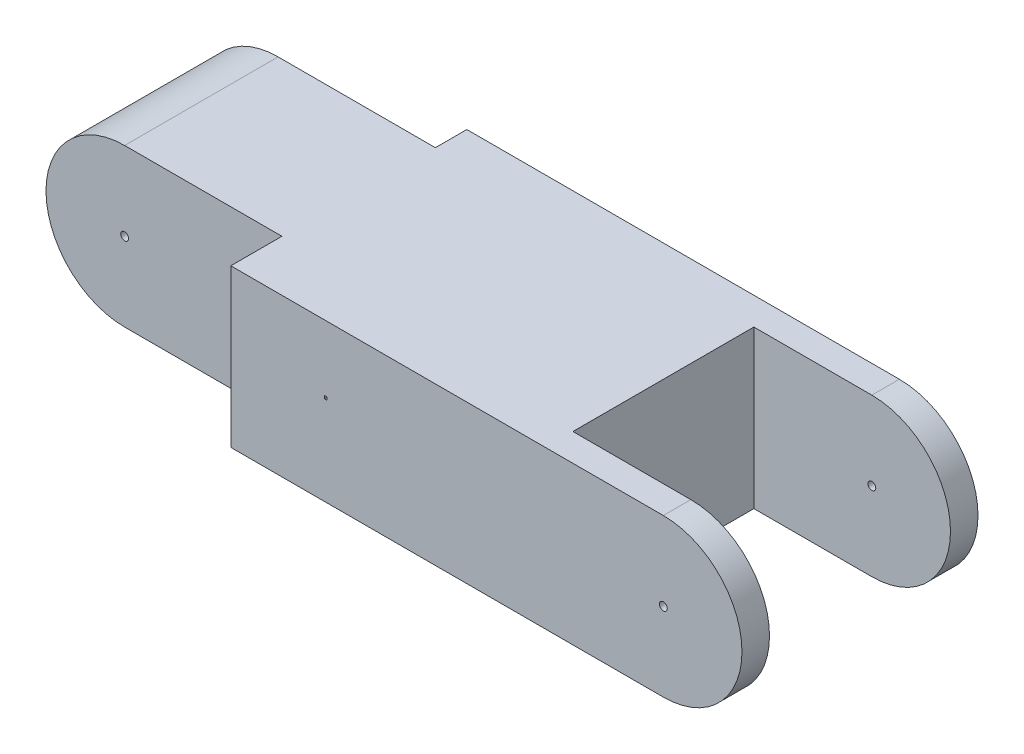
ISO-10303-21;
HEADER;
FILE_DESCRIPTION(('STEP AP214'),'2;1');
FILE_NAME('part.step','',(''),(''),'','','');
FILE_SCHEMA(('AUTOMOTIVE_DESIGN { 1 0 10303 214 1 1 1 1 }'));
ENDSEC;
DATA;
#1=APPLICATION_CONTEXT('core data for automotive mechanical design processes');
#2=APPLICATION_PROTOCOL_DEFINITION('international standard','automotive_design',2000,#1);
#3=PRODUCT_CONTEXT('',#1,'mechanical');
#4=PRODUCT('Part','Part','',(#3));
#5=PRODUCT_RELATED_PRODUCT_CATEGORY('part','',(#4));
#6=PRODUCT_DEFINITION_FORMATION('','',#4);
#7=PRODUCT_DEFINITION_CONTEXT('part definition',#1,'design');
#8=PRODUCT_DEFINITION('design','',#6,#7);
#9=PRODUCT_DEFINITION_SHAPE('','',#8);
#10=(LENGTH_UNIT() NAMED_UNIT(*) SI_UNIT(.MILLI.,.METRE.));
#11=(NAMED_UNIT(*) PLANE_ANGLE_UNIT() SI_UNIT($,.RADIAN.));
#12=(NAMED_UNIT(*) SI_UNIT($,.STERADIAN.) SOLID_ANGLE_UNIT());
#13=UNCERTAINTY_MEASURE_WITH_UNIT(LENGTH_MEASURE(1.E-05),#10,'distance_accuracy_value','');
#14=(GEOMETRIC_REPRESENTATION_CONTEXT(3) GLOBAL_UNCERTAINTY_ASSIGNED_CONTEXT((#13)) GLOBAL_UNIT_ASSIGNED_CONTEXT((#10,
#11,#12)) REPRESENTATION_CONTEXT('',''));
#15=CARTESIAN_POINT('',(0.,0.,0.));
#16=DIRECTION('',(0.,0.,1.));
#17=DIRECTION('',(1.,0.,0.));
#18=AXIS2_PLACEMENT_3D('',#15,#16,#17);
#19=CARTESIAN_POINT('',(0.,20.,-20.0272569339945));
#20=DIRECTION('',(0.,0.,1.));
#21=DIRECTION('',(1.,0.,0.));
#22=AXIS2_PLACEMENT_3D('',#19,#20,#21);
#23=CYLINDRICAL_SURFACE('',#22,20.);
#24=CARTESIAN_POINT('',(0.,20.,33.));
#25=DIRECTION('',(0.,0.,-1.));
#26=DIRECTION('',(-1.,0.,0.));
#27=AXIS2_PLACEMENT_3D('',#24,#25,#26);
#28=CIRCLE('',#27,20.);
#29=CARTESIAN_POINT('',(0.,0.,33.));
#30=VERTEX_POINT('',#29);
#31=CARTESIAN_POINT('',(0.,40.,33.));
#32=VERTEX_POINT('',#31);
#33=EDGE_CURVE('E50',#30,#32,#28,.F.);
#34=ORIENTED_EDGE('',*,*,#33,.T.);
#35=DIRECTION('',(0.,0.,1.));
#36=VECTOR('',#35,1.);
#37=CARTESIAN_POINT('',(0.,40.,-20.0272569339945));
#38=LINE('',#37,#36);
#39=CARTESIAN_POINT('',(0.,40.,40.));
#40=VERTEX_POINT('',#39);
#41=EDGE_CURVE('E325',#32,#40,#38,.T.);
#42=ORIENTED_EDGE('',*,*,#41,.T.);
#43=CARTESIAN_POINT('',(0.,20.,40.));
#44=DIRECTION('',(0.,0.,1.));
#45=DIRECTION('',(-1.,0.,0.));
#46=AXIS2_PLACEMENT_3D('',#43,#44,#45);
#47=CIRCLE('',#46,20.);
#48=CARTESIAN_POINT('',(0.,0.,40.));
#49=VERTEX_POINT('',#48);
#50=EDGE_CURVE('E308',#49,#40,#47,.T.);
#51=ORIENTED_EDGE('',*,*,#50,.F.);
#52=DIRECTION('',(0.,0.,1.));
#53=VECTOR('',#52,1.);
#54=CARTESIAN_POINT('',(0.,0.,-20.0272569339945));
#55=LINE('',#54,#53);
#56=EDGE_CURVE('E330',#30,#49,#55,.T.);
#57=ORIENTED_EDGE('',*,*,#56,.F.);
#58=EDGE_LOOP('',(#34,#42,#51,#57));
#59=FACE_BOUND('',#58,.T.);
#60=ADVANCED_FACE('F41',(#59),#23,.T.);
#61=CARTESIAN_POINT('',(0.,0.,-20.0272569339945));
#62=DIRECTION('',(0.,-1.,0.));
#63=DIRECTION('',(1.,0.,0.));
#64=AXIS2_PLACEMENT_3D('',#61,#62,#63);
#65=PLANE('',#64);
#66=DIRECTION('',(1.,0.,0.));
#67=VECTOR('',#66,1.);
#68=CARTESIAN_POINT('',(0.,0.,-13.0272569339945));
#69=LINE('',#68,#67);
#70=CARTESIAN_POINT('',(-30.,0.,-13.0272569339945));
#71=VERTEX_POINT('',#70);
#72=CARTESIAN_POINT('',(0.,0.,-13.0272569339945));
#73=VERTEX_POINT('',#72);
#74=EDGE_CURVE('E212',#71,#73,#69,.T.);
#75=ORIENTED_EDGE('',*,*,#74,.F.);
#76=DIRECTION('',(0.,0.,-1.));
#77=VECTOR('',#76,1.);
#78=CARTESIAN_POINT('',(-30.,0.,-20.0272569339945));
#79=LINE('',#78,#77);
#80=CARTESIAN_POINT('',(-30.,0.,33.));
#81=VERTEX_POINT('',#80);
#82=EDGE_CURVE('E187',#81,#71,#79,.T.);
#83=ORIENTED_EDGE('',*,*,#82,.F.);
#84=DIRECTION('',(1.,0.,0.));
#85=VECTOR('',#84,1.);
#86=CARTESIAN_POINT('',(0.,0.,33.));
#87=LINE('',#86,#85);
#88=EDGE_CURVE('E208',#81,#30,#87,.T.);
#89=ORIENTED_EDGE('',*,*,#88,.T.);
#90=ORIENTED_EDGE('',*,*,#56,.T.);
#91=DIRECTION('',(1.,0.,0.));
#92=VECTOR('',#91,1.);
#93=CARTESIAN_POINT('',(0.,0.,40.));
#94=LINE('',#93,#92);
#95=CARTESIAN_POINT('',(-110.,0.,40.));
#96=VERTEX_POINT('',#95);
#97=EDGE_CURVE('E314',#96,#49,#94,.T.);
#98=ORIENTED_EDGE('',*,*,#97,.F.);
#99=DIRECTION('',(0.,0.,-1.));
#100=VECTOR('',#99,1.);
#101=CARTESIAN_POINT('',(-110.,0.,40.));
#102=LINE('',#101,#100);
#103=CARTESIAN_POINT('',(-110.,0.,27.));
#104=VERTEX_POINT('',#103);
#105=EDGE_CURVE('E278',#96,#104,#102,.T.);
#106=ORIENTED_EDGE('',*,*,#105,.T.);
#107=DIRECTION('',(1.,0.,0.));
#108=VECTOR('',#107,1.);
#109=CARTESIAN_POINT('',(-170.,0.,27.));
#110=LINE('',#109,#108);
#111=CARTESIAN_POINT('',(-150.,0.,27.));
#112=VERTEX_POINT('',#111);
#113=EDGE_CURVE('E276',#112,#104,#110,.T.);
#114=ORIENTED_EDGE('',*,*,#113,.F.);
#115=DIRECTION('',(0.,0.,1.));
#116=VECTOR('',#115,1.);
#117=CARTESIAN_POINT('',(-150.,0.,-20.0272569339945));
#118=LINE('',#117,#116);
#119=CARTESIAN_POINT('',(-150.,0.,-12.0272569339945));
#120=VERTEX_POINT('',#119);
#121=EDGE_CURVE('E331',#120,#112,#118,.T.);
#122=ORIENTED_EDGE('',*,*,#121,.F.);
#123=DIRECTION('',(1.,0.,0.));
#124=VECTOR('',#123,1.);
#125=CARTESIAN_POINT('',(-170.,0.,-12.0272569339945));
#126=LINE('',#125,#124);
#127=CARTESIAN_POINT('',(-110.,0.,-12.0272569339945));
#128=VERTEX_POINT('',#127);
#129=EDGE_CURVE('E291',#120,#128,#126,.T.);
#130=ORIENTED_EDGE('',*,*,#129,.T.);
#131=DIRECTION('',(0.,0.,1.));
#132=VECTOR('',#131,1.);
#133=CARTESIAN_POINT('',(-110.,0.,-20.0272569339945));
#134=LINE('',#133,#132);
#135=CARTESIAN_POINT('',(-110.,0.,-20.0272569339945));
#136=VERTEX_POINT('',#135);
#137=EDGE_CURVE('E294',#136,#128,#134,.T.);
#138=ORIENTED_EDGE('',*,*,#137,.F.);
#139=DIRECTION('',(1.,0.,0.));
#140=VECTOR('',#139,1.);
#141=CARTESIAN_POINT('',(0.,0.,-20.0272569339945));
#142=LINE('',#141,#140);
#143=CARTESIAN_POINT('',(0.,0.,-20.0272569339945));
#144=VERTEX_POINT('',#143);
#145=EDGE_CURVE('E323',#136,#144,#142,.T.);
#146=ORIENTED_EDGE('',*,*,#145,.T.);
#147=EDGE_CURVE('E326',#144,#73,#55,.T.);
#148=ORIENTED_EDGE('',*,*,#147,.T.);
#149=EDGE_LOOP('',(#75,#83,#89,#90,#98,#106,#114,#122,#130,#138,#146,#148));
#150=FACE_BOUND('',#149,.T.);
#151=ADVANCED_FACE('F373',(#150),#65,.T.);
#152=CARTESIAN_POINT('',(-150.,40.,-20.0272569339945));
#153=DIRECTION('',(0.,1.,0.));
#154=DIRECTION('',(0.,0.,1.));
#155=AXIS2_PLACEMENT_3D('',#152,#153,#154);
#156=PLANE('',#155);
#157=DIRECTION('',(-1.,0.,0.));
#158=VECTOR('',#157,1.);
#159=CARTESIAN_POINT('',(0.,40.,-13.0272569339945));
#160=LINE('',#159,#158);
#161=CARTESIAN_POINT('',(0.,40.,-13.0272569339945));
#162=VERTEX_POINT('',#161);
#163=CARTESIAN_POINT('',(-30.,40.,-13.0272569339945));
#164=VERTEX_POINT('',#163);
#165=EDGE_CURVE('E194',#162,#164,#160,.T.);
#166=ORIENTED_EDGE('',*,*,#165,.F.);
#167=CARTESIAN_POINT('',(0.,40.,-20.0272569339945));
#168=VERTEX_POINT('',#167);
#169=EDGE_CURVE('E337',#168,#162,#38,.T.);
#170=ORIENTED_EDGE('',*,*,#169,.F.);
#171=DIRECTION('',(-1.,0.,0.));
#172=VECTOR('',#171,1.);
#173=CARTESIAN_POINT('',(-150.,40.,-20.0272569339945));
#174=LINE('',#173,#172);
#175=CARTESIAN_POINT('',(-110.,40.,-20.0272569339945));
#176=VERTEX_POINT('',#175);
#177=EDGE_CURVE('E320',#168,#176,#174,.T.);
#178=ORIENTED_EDGE('',*,*,#177,.T.);
#179=DIRECTION('',(0.,0.,1.));
#180=VECTOR('',#179,1.);
#181=CARTESIAN_POINT('',(-110.,40.,-20.0272569339945));
#182=LINE('',#181,#180);
#183=CARTESIAN_POINT('',(-110.,40.,-12.0272569339945));
#184=VERTEX_POINT('',#183);
#185=EDGE_CURVE('E295',#176,#184,#182,.T.);
#186=ORIENTED_EDGE('',*,*,#185,.T.);
#187=DIRECTION('',(1.,0.,0.));
#188=VECTOR('',#187,1.);
#189=CARTESIAN_POINT('',(-170.,40.,-12.0272569339945));
#190=LINE('',#189,#188);
#191=CARTESIAN_POINT('',(-150.,40.,-12.0272569339945));
#192=VERTEX_POINT('',#191);
#193=EDGE_CURVE('E290',#192,#184,#190,.T.);
#194=ORIENTED_EDGE('',*,*,#193,.F.);
#195=DIRECTION('',(0.,0.,1.));
#196=VECTOR('',#195,1.);
#197=CARTESIAN_POINT('',(-150.,40.,-20.0272569339945));
#198=LINE('',#197,#196);
#199=CARTESIAN_POINT('',(-150.,40.,27.));
#200=VERTEX_POINT('',#199);
#201=EDGE_CURVE('E334',#192,#200,#198,.T.);
#202=ORIENTED_EDGE('',*,*,#201,.T.);
#203=DIRECTION('',(1.,0.,0.));
#204=VECTOR('',#203,1.);
#205=CARTESIAN_POINT('',(-170.,40.,27.));
#206=LINE('',#205,#204);
#207=CARTESIAN_POINT('',(-110.,40.,27.));
#208=VERTEX_POINT('',#207);
#209=EDGE_CURVE('E270',#200,#208,#206,.T.);
#210=ORIENTED_EDGE('',*,*,#209,.T.);
#211=DIRECTION('',(0.,0.,-1.));
#212=VECTOR('',#211,1.);
#213=CARTESIAN_POINT('',(-110.,40.,40.));
#214=LINE('',#213,#212);
#215=CARTESIAN_POINT('',(-110.,40.,40.));
#216=VERTEX_POINT('',#215);
#217=EDGE_CURVE('E279',#216,#208,#214,.T.);
#218=ORIENTED_EDGE('',*,*,#217,.F.);
#219=DIRECTION('',(-1.,0.,0.));
#220=VECTOR('',#219,1.);
#221=CARTESIAN_POINT('',(-150.,40.,40.));
#222=LINE('',#221,#220);
#223=EDGE_CURVE('E311',#40,#216,#222,.T.);
#224=ORIENTED_EDGE('',*,*,#223,.F.);
#225=ORIENTED_EDGE('',*,*,#41,.F.);
#226=DIRECTION('',(-1.,0.,0.));
#227=VECTOR('',#226,1.);
#228=CARTESIAN_POINT('',(0.,40.,33.));
#229=LINE('',#228,#227);
#230=CARTESIAN_POINT('',(-30.,40.,33.));
#231=VERTEX_POINT('',#230);
#232=EDGE_CURVE('E191',#32,#231,#229,.T.);
#233=ORIENTED_EDGE('',*,*,#232,.T.);
#234=DIRECTION('',(0.,0.,1.));
#235=VECTOR('',#234,1.);
#236=CARTESIAN_POINT('',(-30.,40.,0.));
#237=LINE('',#236,#235);
#238=EDGE_CURVE('E184',#164,#231,#237,.T.);
#239=ORIENTED_EDGE('',*,*,#238,.F.);
#240=EDGE_LOOP('',(#166,#170,#178,#186,#194,#202,#210,#218,#224,#225,#233,#239));
#241=FACE_BOUND('',#240,.T.);
#242=ADVANCED_FACE('F201',(#241),#156,.T.);
#243=CARTESIAN_POINT('',(-150.,20.,-20.0272569339945));
#244=DIRECTION('',(0.,0.,1.));
#245=DIRECTION('',(1.,0.,0.));
#246=AXIS2_PLACEMENT_3D('',#243,#244,#245);
#247=CYLINDRICAL_SURFACE('',#246,20.);
#248=ORIENTED_EDGE('',*,*,#121,.T.);
#249=CARTESIAN_POINT('',(-150.,20.,27.));
#250=DIRECTION('',(0.,0.,1.));
#251=DIRECTION('',(1.,0.,0.));
#252=AXIS2_PLACEMENT_3D('',#249,#250,#251);
#253=CIRCLE('',#252,20.);
#254=EDGE_CURVE('E329',#112,#200,#253,.F.);
#255=ORIENTED_EDGE('',*,*,#254,.T.);
#256=ORIENTED_EDGE('',*,*,#201,.F.);
#257=CARTESIAN_POINT('',(-150.,20.,-12.0272569339945));
#258=DIRECTION('',(0.,0.,1.));
#259=DIRECTION('',(1.,0.,0.));
#260=AXIS2_PLACEMENT_3D('',#257,#258,#259);
#261=CIRCLE('',#260,20.);
#262=EDGE_CURVE('E304',#120,#192,#261,.F.);
#263=ORIENTED_EDGE('',*,*,#262,.F.);
#264=EDGE_LOOP('',(#248,#255,#256,#263));
#265=FACE_BOUND('',#264,.T.);
#266=ADVANCED_FACE('F365',(#265),#247,.T.);
#267=CARTESIAN_POINT('',(0.,20.,-20.0272569339945));
#268=DIRECTION('',(0.,0.,-1.));
#269=DIRECTION('',(-1.,0.,0.));
#270=AXIS2_PLACEMENT_3D('',#267,#268,#269);
#271=PLANE('',#270);
#272=CARTESIAN_POINT('',(0.,20.,-20.0272569339945));
#273=DIRECTION('',(0.,0.,-1.));
#274=DIRECTION('',(-1.,0.,0.));
#275=AXIS2_PLACEMENT_3D('',#272,#273,#274);
#276=CIRCLE('',#275,1.);
#277=CARTESIAN_POINT('',(-1.,20.,-20.0272569339945));
#278=VERTEX_POINT('',#277);
#279=EDGE_CURVE('E199',#278,#278,#276,.T.);
#280=ORIENTED_EDGE('',*,*,#279,.F.);
#281=EDGE_LOOP('',(#280));
#282=FACE_BOUND('',#281,.T.);
#283=ORIENTED_EDGE('',*,*,#145,.F.);
#284=DIRECTION('',(0.,1.,0.));
#285=VECTOR('',#284,1.);
#286=CARTESIAN_POINT('',(-110.,0.,-20.0272569339945));
#287=LINE('',#286,#285);
#288=EDGE_CURVE('E301',#136,#176,#287,.T.);
#289=ORIENTED_EDGE('',*,*,#288,.T.);
#290=ORIENTED_EDGE('',*,*,#177,.F.);
#291=CARTESIAN_POINT('',(0.,20.,-20.0272569339945));
#292=DIRECTION('',(0.,0.,1.));
#293=DIRECTION('',(-1.,0.,0.));
#294=AXIS2_PLACEMENT_3D('',#291,#292,#293);
#295=CIRCLE('',#294,20.);
#296=EDGE_CURVE('E317',#144,#168,#295,.T.);
#297=ORIENTED_EDGE('',*,*,#296,.F.);
#298=EDGE_LOOP('',(#283,#289,#290,#297));
#299=FACE_BOUND('',#298,.T.);
#300=ADVANCED_FACE('F362',(#282,#299),#271,.T.);
#301=ORIENTED_EDGE('',*,*,#169,.T.);
#302=CARTESIAN_POINT('',(0.,20.,-13.0272569339945));
#303=DIRECTION('',(0.,0.,-1.));
#304=DIRECTION('',(-1.,0.,0.));
#305=AXIS2_PLACEMENT_3D('',#302,#303,#304);
#306=CIRCLE('',#305,20.);
#307=EDGE_CURVE('E11',#73,#162,#306,.F.);
#308=ORIENTED_EDGE('',*,*,#307,.F.);
#309=ORIENTED_EDGE('',*,*,#147,.F.);
#310=ORIENTED_EDGE('',*,*,#296,.T.);
#311=EDGE_LOOP('',(#301,#308,#309,#310));
#312=FACE_BOUND('',#311,.T.);
#313=ADVANCED_FACE('F43',(#312),#23,.T.);
#314=CARTESIAN_POINT('',(0.,20.,40.));
#315=DIRECTION('',(0.,0.,-1.));
#316=DIRECTION('',(-1.,0.,0.));
#317=AXIS2_PLACEMENT_3D('',#314,#315,#316);
#318=PLANE('',#317);
#319=CARTESIAN_POINT('',(0.,20.,40.));
#320=DIRECTION('',(0.,0.,1.));
#321=DIRECTION('',(1.,0.,0.));
#322=AXIS2_PLACEMENT_3D('',#319,#320,#321);
#323=CIRCLE('',#322,1.);
#324=CARTESIAN_POINT('',(1.,20.,40.));
#325=VERTEX_POINT('',#324);
#326=EDGE_CURVE('E344',#325,#325,#323,.T.);
#327=ORIENTED_EDGE('',*,*,#326,.F.);
#328=EDGE_LOOP('',(#327));
#329=FACE_BOUND('',#328,.T.);
#330=DIRECTION('',(1.,0.,0.));
#331=VECTOR('',#330,1.);
#332=CARTESIAN_POINT('',(-86.1875819309348,22.5876163151839,40.));
#333=LINE('',#332,#331);
#334=CARTESIAN_POINT('',(-86.1875819309348,22.5876163151839,40.));
#335=VERTEX_POINT('',#334);
#336=CARTESIAN_POINT('',(-85.5878607279806,22.5876163151839,40.));
#337=VERTEX_POINT('',#336);
#338=EDGE_CURVE('E260',#335,#337,#333,.T.);
#339=ORIENTED_EDGE('',*,*,#338,.F.);
#340=DIRECTION('',(0.,-1.,0.));
#341=VECTOR('',#340,1.);
#342=CARTESIAN_POINT('',(-86.1875819309348,23.3508978462165,40.));
#343=LINE('',#342,#341);
#344=CARTESIAN_POINT('',(-86.1875819309348,23.3508978462165,40.));
#345=VERTEX_POINT('',#344);
#346=EDGE_CURVE('E66',#345,#335,#343,.T.);
#347=ORIENTED_EDGE('',*,*,#346,.F.);
#348=DIRECTION('',(-1.,0.,0.));
#349=VECTOR('',#348,1.);
#350=CARTESIAN_POINT('',(-86.1875819309348,23.3508978462165,40.));
#351=LINE('',#350,#349);
#352=CARTESIAN_POINT('',(-85.5878607279806,23.3508978462165,40.));
#353=VERTEX_POINT('',#352);
#354=EDGE_CURVE('E249',#353,#345,#351,.T.);
#355=ORIENTED_EDGE('',*,*,#354,.F.);
#356=DIRECTION('',(0.,1.,0.));
#357=VECTOR('',#356,1.);
#358=CARTESIAN_POINT('',(-85.5878607279806,23.3508978462165,40.));
#359=LINE('',#358,#357);
#360=EDGE_CURVE('E263',#337,#353,#359,.T.);
#361=ORIENTED_EDGE('',*,*,#360,.F.);
#362=EDGE_LOOP('',(#339,#347,#355,#361));
#363=FACE_BOUND('',#362,.T.);
#364=ORIENTED_EDGE('',*,*,#223,.T.);
#365=DIRECTION('',(0.,1.,0.));
#366=VECTOR('',#365,1.);
#367=CARTESIAN_POINT('',(-110.,0.,40.));
#368=LINE('',#367,#366);
#369=EDGE_CURVE('E282',#96,#216,#368,.T.);
#370=ORIENTED_EDGE('',*,*,#369,.F.);
#371=ORIENTED_EDGE('',*,*,#97,.T.);
#372=ORIENTED_EDGE('',*,*,#50,.T.);
#373=EDGE_LOOP('',(#364,#370,#371,#372));
#374=FACE_BOUND('',#373,.T.);
#375=ADVANCED_FACE('F396',(#329,#363,#374),#318,.F.);
#376=CARTESIAN_POINT('',(-110.,0.,-20.0272569339945));
#377=DIRECTION('',(-1.,0.,0.));
#378=DIRECTION('',(0.,0.,1.));
#379=AXIS2_PLACEMENT_3D('',#376,#377,#378);
#380=PLANE('',#379);
#381=ORIENTED_EDGE('',*,*,#185,.F.);
#382=ORIENTED_EDGE('',*,*,#288,.F.);
#383=ORIENTED_EDGE('',*,*,#137,.T.);
#384=DIRECTION('',(0.,1.,0.));
#385=VECTOR('',#384,1.);
#386=CARTESIAN_POINT('',(-110.,0.,-12.0272569339945));
#387=LINE('',#386,#385);
#388=EDGE_CURVE('E297',#128,#184,#387,.T.);
#389=ORIENTED_EDGE('',*,*,#388,.T.);
#390=EDGE_LOOP('',(#381,#382,#383,#389));
#391=FACE_BOUND('',#390,.T.);
#392=ADVANCED_FACE('F378',(#391),#380,.T.);
#393=CARTESIAN_POINT('',(-170.,0.,-12.0272569339945));
#394=DIRECTION('',(0.,0.,1.));
#395=DIRECTION('',(1.,0.,0.));
#396=AXIS2_PLACEMENT_3D('',#393,#394,#395);
#397=PLANE('',#396);
#398=DIRECTION('',(-1.,0.,0.));
#399=VECTOR('',#398,1.);
#400=CARTESIAN_POINT('',(-120.,9.99999999999998,-12.0272569339945));
#401=LINE('',#400,#399);
#402=CARTESIAN_POINT('',(-120.,9.99999999999998,-12.0272569339945));
#403=VERTEX_POINT('',#402);
#404=CARTESIAN_POINT('',(-164.,9.99999999999998,-12.0272569339945));
#405=VERTEX_POINT('',#404);
#406=EDGE_CURVE('E230',#403,#405,#401,.T.);
#407=ORIENTED_EDGE('',*,*,#406,.F.);
#408=DIRECTION('',(0.,-1.,0.));
#409=VECTOR('',#408,1.);
#410=CARTESIAN_POINT('',(-120.,9.99999999999998,-12.0272569339945));
#411=LINE('',#410,#409);
#412=CARTESIAN_POINT('',(-120.,30.,-12.0272569339945));
#413=VERTEX_POINT('',#412);
#414=EDGE_CURVE('E58',#413,#403,#411,.T.);
#415=ORIENTED_EDGE('',*,*,#414,.F.);
#416=DIRECTION('',(1.,0.,0.));
#417=VECTOR('',#416,1.);
#418=CARTESIAN_POINT('',(-120.,30.,-12.0272569339945));
#419=LINE('',#418,#417);
#420=CARTESIAN_POINT('',(-164.,30.,-12.0272569339945));
#421=VERTEX_POINT('',#420);
#422=EDGE_CURVE('E219',#421,#413,#419,.T.);
#423=ORIENTED_EDGE('',*,*,#422,.F.);
#424=DIRECTION('',(0.,1.,0.));
#425=VECTOR('',#424,1.);
#426=CARTESIAN_POINT('',(-164.,9.99999999999998,-12.0272569339945));
#427=LINE('',#426,#425);
#428=EDGE_CURVE('E233',#405,#421,#427,.T.);
#429=ORIENTED_EDGE('',*,*,#428,.F.);
#430=EDGE_LOOP('',(#407,#415,#423,#429));
#431=FACE_BOUND('',#430,.T.);
#432=ORIENTED_EDGE('',*,*,#262,.T.);
#433=ORIENTED_EDGE('',*,*,#193,.T.);
#434=ORIENTED_EDGE('',*,*,#388,.F.);
#435=ORIENTED_EDGE('',*,*,#129,.F.);
#436=EDGE_LOOP('',(#432,#433,#434,#435));
#437=FACE_BOUND('',#436,.T.);
#438=ADVANCED_FACE('F381',(#431,#437),#397,.F.);
#439=CARTESIAN_POINT('',(-170.,0.,27.));
#440=DIRECTION('',(0.,0.,1.));
#441=DIRECTION('',(1.,0.,0.));
#442=AXIS2_PLACEMENT_3D('',#439,#440,#441);
#443=PLANE('',#442);
#444=CARTESIAN_POINT('',(-150.,20.,27.));
#445=DIRECTION('',(0.,0.,1.));
#446=DIRECTION('',(1.,0.,0.));
#447=AXIS2_PLACEMENT_3D('',#444,#445,#446);
#448=CIRCLE('',#447,0.999999999999998);
#449=CARTESIAN_POINT('',(-149.,20.,27.));
#450=VERTEX_POINT('',#449);
#451=EDGE_CURVE('E354',#450,#450,#448,.T.);
#452=ORIENTED_EDGE('',*,*,#451,.F.);
#453=EDGE_LOOP('',(#452));
#454=FACE_BOUND('',#453,.T.);
#455=ORIENTED_EDGE('',*,*,#113,.T.);
#456=DIRECTION('',(0.,1.,0.));
#457=VECTOR('',#456,1.);
#458=CARTESIAN_POINT('',(-110.,0.,27.));
#459=LINE('',#458,#457);
#460=EDGE_CURVE('E288',#104,#208,#459,.T.);
#461=ORIENTED_EDGE('',*,*,#460,.T.);
#462=ORIENTED_EDGE('',*,*,#209,.F.);
#463=ORIENTED_EDGE('',*,*,#254,.F.);
#464=EDGE_LOOP('',(#455,#461,#462,#463));
#465=FACE_BOUND('',#464,.T.);
#466=ADVANCED_FACE('F389',(#454,#465),#443,.T.);
#467=CARTESIAN_POINT('',(-110.,0.,40.));
#468=DIRECTION('',(1.,0.,0.));
#469=DIRECTION('',(0.,0.,-1.));
#470=AXIS2_PLACEMENT_3D('',#467,#468,#469);
#471=PLANE('',#470);
#472=ORIENTED_EDGE('',*,*,#217,.T.);
#473=ORIENTED_EDGE('',*,*,#460,.F.);
#474=ORIENTED_EDGE('',*,*,#105,.F.);
#475=ORIENTED_EDGE('',*,*,#369,.T.);
#476=EDGE_LOOP('',(#472,#473,#474,#475));
#477=FACE_BOUND('',#476,.T.);
#478=ADVANCED_FACE('F392',(#477),#471,.F.);
#479=CARTESIAN_POINT('',(-86.1875819309348,23.3508978462165,34.));
#480=DIRECTION('',(-1.,0.,0.));
#481=DIRECTION('',(0.,0.,1.));
#482=AXIS2_PLACEMENT_3D('',#479,#480,#481);
#483=PLANE('',#482);
#484=ORIENTED_EDGE('',*,*,#346,.T.);
#485=DIRECTION('',(0.,0.,1.));
#486=VECTOR('',#485,1.);
#487=CARTESIAN_POINT('',(-86.1875819309348,22.5876163151839,34.));
#488=LINE('',#487,#486);
#489=CARTESIAN_POINT('',(-86.1875819309348,22.5876163151839,34.));
#490=VERTEX_POINT('',#489);
#491=EDGE_CURVE('E258',#490,#335,#488,.T.);
#492=ORIENTED_EDGE('',*,*,#491,.F.);
#493=DIRECTION('',(0.,-1.,0.));
#494=VECTOR('',#493,1.);
#495=CARTESIAN_POINT('',(-86.1875819309348,23.3508978462165,34.));
#496=LINE('',#495,#494);
#497=CARTESIAN_POINT('',(-86.1875819309348,23.3508978462165,34.));
#498=VERTEX_POINT('',#497);
#499=EDGE_CURVE('E245',#498,#490,#496,.T.);
#500=ORIENTED_EDGE('',*,*,#499,.F.);
#501=DIRECTION('',(0.,0.,1.));
#502=VECTOR('',#501,1.);
#503=CARTESIAN_POINT('',(-86.1875819309348,23.3508978462165,34.));
#504=LINE('',#503,#502);
#505=EDGE_CURVE('E268',#498,#345,#504,.T.);
#506=ORIENTED_EDGE('',*,*,#505,.T.);
#507=EDGE_LOOP('',(#484,#492,#500,#506));
#508=FACE_BOUND('',#507,.T.);
#509=ADVANCED_FACE('F466',(#508),#483,.F.);
#510=CARTESIAN_POINT('',(-86.1875819309348,23.3508978462165,34.));
#511=DIRECTION('',(0.,1.,0.));
#512=DIRECTION('',(0.,0.,1.));
#513=AXIS2_PLACEMENT_3D('',#510,#511,#512);
#514=PLANE('',#513);
#515=ORIENTED_EDGE('',*,*,#354,.T.);
#516=ORIENTED_EDGE('',*,*,#505,.F.);
#517=DIRECTION('',(-1.,0.,0.));
#518=VECTOR('',#517,1.);
#519=CARTESIAN_POINT('',(-86.1875819309348,23.3508978462165,34.));
#520=LINE('',#519,#518);
#521=CARTESIAN_POINT('',(-85.5878607279806,23.3508978462165,34.));
#522=VERTEX_POINT('',#521);
#523=EDGE_CURVE('E255',#522,#498,#520,.T.);
#524=ORIENTED_EDGE('',*,*,#523,.F.);
#525=DIRECTION('',(0.,0.,1.));
#526=VECTOR('',#525,1.);
#527=CARTESIAN_POINT('',(-85.5878607279806,23.3508978462165,34.));
#528=LINE('',#527,#526);
#529=EDGE_CURVE('E271',#522,#353,#528,.T.);
#530=ORIENTED_EDGE('',*,*,#529,.T.);
#531=EDGE_LOOP('',(#515,#516,#524,#530));
#532=FACE_BOUND('',#531,.T.);
#533=ADVANCED_FACE('F475',(#532),#514,.F.);
#534=CARTESIAN_POINT('',(-85.5878607279806,23.3508978462165,34.));
#535=DIRECTION('',(1.,0.,0.));
#536=DIRECTION('',(0.,0.,-1.));
#537=AXIS2_PLACEMENT_3D('',#534,#535,#536);
#538=PLANE('',#537);
#539=ORIENTED_EDGE('',*,*,#360,.T.);
#540=ORIENTED_EDGE('',*,*,#529,.F.);
#541=DIRECTION('',(0.,1.,0.));
#542=VECTOR('',#541,1.);
#543=CARTESIAN_POINT('',(-85.5878607279806,23.3508978462165,34.));
#544=LINE('',#543,#542);
#545=CARTESIAN_POINT('',(-85.5878607279806,22.5876163151839,34.));
#546=VERTEX_POINT('',#545);
#547=EDGE_CURVE('E252',#546,#522,#544,.T.);
#548=ORIENTED_EDGE('',*,*,#547,.F.);
#549=DIRECTION('',(0.,0.,1.));
#550=VECTOR('',#549,1.);
#551=CARTESIAN_POINT('',(-85.5878607279806,22.5876163151839,34.));
#552=LINE('',#551,#550);
#553=EDGE_CURVE('E273',#546,#337,#552,.T.);
#554=ORIENTED_EDGE('',*,*,#553,.T.);
#555=EDGE_LOOP('',(#539,#540,#548,#554));
#556=FACE_BOUND('',#555,.T.);
#557=ADVANCED_FACE('F484',(#556),#538,.F.);
#558=CARTESIAN_POINT('',(-86.1875819309348,22.5876163151839,34.));
#559=DIRECTION('',(0.,-1.,0.));
#560=DIRECTION('',(0.,0.,-1.));
#561=AXIS2_PLACEMENT_3D('',#558,#559,#560);
#562=PLANE('',#561);
#563=ORIENTED_EDGE('',*,*,#338,.T.);
#564=ORIENTED_EDGE('',*,*,#553,.F.);
#565=DIRECTION('',(1.,0.,0.));
#566=VECTOR('',#565,1.);
#567=CARTESIAN_POINT('',(-86.1875819309348,22.5876163151839,34.));
#568=LINE('',#567,#566);
#569=EDGE_CURVE('E248',#490,#546,#568,.T.);
#570=ORIENTED_EDGE('',*,*,#569,.F.);
#571=ORIENTED_EDGE('',*,*,#491,.T.);
#572=EDGE_LOOP('',(#563,#564,#570,#571));
#573=FACE_BOUND('',#572,.T.);
#574=ADVANCED_FACE('F494',(#573),#562,.F.);
#575=CARTESIAN_POINT('',(0.,0.,34.));
#576=DIRECTION('',(0.,0.,1.));
#577=DIRECTION('',(1.,0.,0.));
#578=AXIS2_PLACEMENT_3D('',#575,#576,#577);
#579=PLANE('',#578);
#580=ORIENTED_EDGE('',*,*,#499,.T.);
#581=ORIENTED_EDGE('',*,*,#569,.T.);
#582=ORIENTED_EDGE('',*,*,#547,.T.);
#583=ORIENTED_EDGE('',*,*,#523,.T.);
#584=EDGE_LOOP('',(#580,#581,#582,#583));
#585=FACE_BOUND('',#584,.T.);
#586=ADVANCED_FACE('F504',(#585),#579,.T.);
#587=CARTESIAN_POINT('',(-120.,9.99999999999998,15.9727430660055));
#588=DIRECTION('',(1.,0.,0.));
#589=DIRECTION('',(0.,0.,-1.));
#590=AXIS2_PLACEMENT_3D('',#587,#588,#589);
#591=PLANE('',#590);
#592=ORIENTED_EDGE('',*,*,#414,.T.);
#593=DIRECTION('',(0.,0.,-1.));
#594=VECTOR('',#593,1.);
#595=CARTESIAN_POINT('',(-120.,9.99999999999998,15.9727430660055));
#596=LINE('',#595,#594);
#597=CARTESIAN_POINT('',(-120.,9.99999999999998,15.9727430660055));
#598=VERTEX_POINT('',#597);
#599=EDGE_CURVE('E228',#598,#403,#596,.T.);
#600=ORIENTED_EDGE('',*,*,#599,.F.);
#601=DIRECTION('',(0.,-1.,0.));
#602=VECTOR('',#601,1.);
#603=CARTESIAN_POINT('',(-120.,9.99999999999998,15.9727430660055));
#604=LINE('',#603,#602);
#605=CARTESIAN_POINT('',(-120.,30.,15.9727430660055));
#606=VERTEX_POINT('',#605);
#607=EDGE_CURVE('E215',#606,#598,#604,.T.);
#608=ORIENTED_EDGE('',*,*,#607,.F.);
#609=DIRECTION('',(0.,0.,-1.));
#610=VECTOR('',#609,1.);
#611=CARTESIAN_POINT('',(-120.,30.,15.9727430660055));
#612=LINE('',#611,#610);
#613=EDGE_CURVE('E238',#606,#413,#612,.T.);
#614=ORIENTED_EDGE('',*,*,#613,.T.);
#615=EDGE_LOOP('',(#592,#600,#608,#614));
#616=FACE_BOUND('',#615,.T.);
#617=ADVANCED_FACE('F514',(#616),#591,.F.);
#618=CARTESIAN_POINT('',(-120.,30.,15.9727430660055));
#619=DIRECTION('',(0.,1.,0.));
#620=DIRECTION('',(0.,0.,1.));
#621=AXIS2_PLACEMENT_3D('',#618,#619,#620);
#622=PLANE('',#621);
#623=ORIENTED_EDGE('',*,*,#422,.T.);
#624=ORIENTED_EDGE('',*,*,#613,.F.);
#625=DIRECTION('',(1.,0.,0.));
#626=VECTOR('',#625,1.);
#627=CARTESIAN_POINT('',(-120.,30.,15.9727430660055));
#628=LINE('',#627,#626);
#629=CARTESIAN_POINT('',(-164.,30.,15.9727430660055));
#630=VERTEX_POINT('',#629);
#631=EDGE_CURVE('E225',#630,#606,#628,.T.);
#632=ORIENTED_EDGE('',*,*,#631,.F.);
#633=DIRECTION('',(0.,0.,-1.));
#634=VECTOR('',#633,1.);
#635=CARTESIAN_POINT('',(-164.,30.,15.9727430660055));
#636=LINE('',#635,#634);
#637=EDGE_CURVE('E240',#630,#421,#636,.T.);
#638=ORIENTED_EDGE('',*,*,#637,.T.);
#639=EDGE_LOOP('',(#623,#624,#632,#638));
#640=FACE_BOUND('',#639,.T.);
#641=ADVANCED_FACE('F525',(#640),#622,.F.);
#642=CARTESIAN_POINT('',(-164.,9.99999999999998,15.9727430660055));
#643=DIRECTION('',(-1.,0.,0.));
#644=DIRECTION('',(0.,-1.,0.));
#645=AXIS2_PLACEMENT_3D('',#642,#643,#644);
#646=PLANE('',#645);
#647=ORIENTED_EDGE('',*,*,#428,.T.);
#648=ORIENTED_EDGE('',*,*,#637,.F.);
#649=DIRECTION('',(0.,1.,0.));
#650=VECTOR('',#649,1.);
#651=CARTESIAN_POINT('',(-164.,9.99999999999998,15.9727430660055));
#652=LINE('',#651,#650);
#653=CARTESIAN_POINT('',(-164.,9.99999999999998,15.9727430660055));
#654=VERTEX_POINT('',#653);
#655=EDGE_CURVE('E222',#654,#630,#652,.T.);
#656=ORIENTED_EDGE('',*,*,#655,.F.);
#657=DIRECTION('',(0.,0.,-1.));
#658=VECTOR('',#657,1.);
#659=CARTESIAN_POINT('',(-164.,9.99999999999998,15.9727430660055));
#660=LINE('',#659,#658);
#661=EDGE_CURVE('E242',#654,#405,#660,.T.);
#662=ORIENTED_EDGE('',*,*,#661,.T.);
#663=EDGE_LOOP('',(#647,#648,#656,#662));
#664=FACE_BOUND('',#663,.T.);
#665=ADVANCED_FACE('F534',(#664),#646,.F.);
#666=CARTESIAN_POINT('',(-120.,9.99999999999998,15.9727430660055));
#667=DIRECTION('',(0.,-1.,0.));
#668=DIRECTION('',(0.,0.,-1.));
#669=AXIS2_PLACEMENT_3D('',#666,#667,#668);
#670=PLANE('',#669);
#671=ORIENTED_EDGE('',*,*,#406,.T.);
#672=ORIENTED_EDGE('',*,*,#661,.F.);
#673=DIRECTION('',(-1.,0.,0.));
#674=VECTOR('',#673,1.);
#675=CARTESIAN_POINT('',(-120.,9.99999999999998,15.9727430660055));
#676=LINE('',#675,#674);
#677=EDGE_CURVE('E218',#598,#654,#676,.T.);
#678=ORIENTED_EDGE('',*,*,#677,.F.);
#679=ORIENTED_EDGE('',*,*,#599,.T.);
#680=EDGE_LOOP('',(#671,#672,#678,#679));
#681=FACE_BOUND('',#680,.T.);
#682=ADVANCED_FACE('F544',(#681),#670,.F.);
#683=CARTESIAN_POINT('',(0.,0.,15.9727430660055));
#684=DIRECTION('',(0.,0.,1.));
#685=DIRECTION('',(1.,0.,0.));
#686=AXIS2_PLACEMENT_3D('',#683,#684,#685);
#687=PLANE('',#686);
#688=CARTESIAN_POINT('',(-150.,20.,15.9727430660055));
#689=DIRECTION('',(0.,0.,1.));
#690=DIRECTION('',(1.,0.,0.));
#691=AXIS2_PLACEMENT_3D('',#688,#689,#690);
#692=CIRCLE('',#691,0.999999999999998);
#693=CARTESIAN_POINT('',(-149.,20.,15.9727430660055));
#694=VERTEX_POINT('',#693);
#695=EDGE_CURVE('E45',#694,#694,#692,.T.);
#696=ORIENTED_EDGE('',*,*,#695,.T.);
#697=EDGE_LOOP('',(#696));
#698=FACE_BOUND('',#697,.T.);
#699=ORIENTED_EDGE('',*,*,#607,.T.);
#700=ORIENTED_EDGE('',*,*,#677,.T.);
#701=ORIENTED_EDGE('',*,*,#655,.T.);
#702=ORIENTED_EDGE('',*,*,#631,.T.);
#703=EDGE_LOOP('',(#699,#700,#701,#702));
#704=FACE_BOUND('',#703,.T.);
#705=ADVANCED_FACE('F412',(#698,#704),#687,.F.);
#706=CARTESIAN_POINT('',(0.,-113.,-13.0272569339945));
#707=DIRECTION('',(0.,0.,-1.));
#708=DIRECTION('',(-1.,0.,0.));
#709=AXIS2_PLACEMENT_3D('',#706,#707,#708);
#710=PLANE('',#709);
#711=CARTESIAN_POINT('',(0.,20.,-13.0272569339945));
#712=DIRECTION('',(0.,0.,-1.));
#713=DIRECTION('',(-1.,0.,0.));
#714=AXIS2_PLACEMENT_3D('',#711,#712,#713);
#715=CIRCLE('',#714,1.);
#716=CARTESIAN_POINT('',(-1.,20.,-13.0272569339945));
#717=VERTEX_POINT('',#716);
#718=EDGE_CURVE('E343',#717,#717,#715,.T.);
#719=ORIENTED_EDGE('',*,*,#718,.T.);
#720=EDGE_LOOP('',(#719));
#721=FACE_BOUND('',#720,.T.);
#722=ORIENTED_EDGE('',*,*,#74,.T.);
#723=ORIENTED_EDGE('',*,*,#307,.T.);
#724=ORIENTED_EDGE('',*,*,#165,.T.);
#725=DIRECTION('',(0.,1.,0.));
#726=VECTOR('',#725,1.);
#727=CARTESIAN_POINT('',(-30.,-113.,-13.0272569339945));
#728=LINE('',#727,#726);
#729=EDGE_CURVE('E179',#71,#164,#728,.T.);
#730=ORIENTED_EDGE('',*,*,#729,.F.);
#731=EDGE_LOOP('',(#722,#723,#724,#730));
#732=FACE_BOUND('',#731,.T.);
#733=ADVANCED_FACE('F195',(#721,#732),#710,.F.);
#734=CARTESIAN_POINT('',(0.,-113.,33.));
#735=DIRECTION('',(0.,0.,-1.));
#736=DIRECTION('',(-1.,0.,0.));
#737=AXIS2_PLACEMENT_3D('',#734,#735,#736);
#738=PLANE('',#737);
#739=CARTESIAN_POINT('',(0.,20.,33.));
#740=DIRECTION('',(0.,0.,-1.));
#741=DIRECTION('',(-1.,0.,0.));
#742=AXIS2_PLACEMENT_3D('',#739,#740,#741);
#743=CIRCLE('',#742,1.);
#744=CARTESIAN_POINT('',(-1.,20.,33.));
#745=VERTEX_POINT('',#744);
#746=EDGE_CURVE('E341',#745,#745,#743,.T.);
#747=ORIENTED_EDGE('',*,*,#746,.F.);
#748=EDGE_LOOP('',(#747));
#749=FACE_BOUND('',#748,.T.);
#750=DIRECTION('',(0.,1.,0.));
#751=VECTOR('',#750,1.);
#752=CARTESIAN_POINT('',(-30.,-113.,33.));
#753=LINE('',#752,#751);
#754=EDGE_CURVE('E190',#81,#231,#753,.T.);
#755=ORIENTED_EDGE('',*,*,#754,.T.);
#756=ORIENTED_EDGE('',*,*,#232,.F.);
#757=ORIENTED_EDGE('',*,*,#33,.F.);
#758=ORIENTED_EDGE('',*,*,#88,.F.);
#759=EDGE_LOOP('',(#755,#756,#757,#758));
#760=FACE_BOUND('',#759,.T.);
#761=ADVANCED_FACE('F401',(#749,#760),#738,.T.);
#762=CARTESIAN_POINT('',(-30.,-113.,0.));
#763=DIRECTION('',(-1.,0.,0.));
#764=DIRECTION('',(0.,0.,1.));
#765=AXIS2_PLACEMENT_3D('',#762,#763,#764);
#766=PLANE('',#765);
#767=ORIENTED_EDGE('',*,*,#82,.T.);
#768=ORIENTED_EDGE('',*,*,#729,.T.);
#769=ORIENTED_EDGE('',*,*,#238,.T.);
#770=ORIENTED_EDGE('',*,*,#754,.F.);
#771=EDGE_LOOP('',(#767,#768,#769,#770));
#772=FACE_BOUND('',#771,.T.);
#773=ADVANCED_FACE('F181',(#772),#766,.F.);
#774=CARTESIAN_POINT('',(0.,20.,-113.));
#775=DIRECTION('',(0.,0.,1.));
#776=DIRECTION('',(1.,0.,0.));
#777=AXIS2_PLACEMENT_3D('',#774,#775,#776);
#778=CYLINDRICAL_SURFACE('',#777,1.);
#779=ORIENTED_EDGE('',*,*,#746,.T.);
#780=EDGE_LOOP('',(#779));
#781=FACE_BOUND('',#780,.T.);
#782=ORIENTED_EDGE('',*,*,#326,.T.);
#783=EDGE_LOOP('',(#782));
#784=FACE_BOUND('',#783,.T.);
#785=ADVANCED_FACE('F410',(#781,#784),#778,.F.);
#786=ORIENTED_EDGE('',*,*,#279,.T.);
#787=EDGE_LOOP('',(#786));
#788=FACE_BOUND('',#787,.T.);
#789=ORIENTED_EDGE('',*,*,#718,.F.);
#790=EDGE_LOOP('',(#789));
#791=FACE_BOUND('',#790,.T.);
#792=ADVANCED_FACE('F359',(#788,#791),#778,.F.);
#793=CARTESIAN_POINT('',(-150.,20.,-45.0000000000001));
#794=DIRECTION('',(0.,0.,1.));
#795=DIRECTION('',(1.,0.,0.));
#796=AXIS2_PLACEMENT_3D('',#793,#794,#795);
#797=CYLINDRICAL_SURFACE('',#796,0.999999999999998);
#798=ORIENTED_EDGE('',*,*,#451,.T.);
#799=EDGE_LOOP('',(#798));
#800=FACE_BOUND('',#799,.T.);
#801=ORIENTED_EDGE('',*,*,#695,.F.);
#802=EDGE_LOOP('',(#801));
#803=FACE_BOUND('',#802,.T.);
#804=ADVANCED_FACE('F602',(#800,#803),#797,.F.);
#805=CLOSED_SHELL('',(#60,#151,#242,#266,#300,#313,#375,#392,#438,#466,#478,#509,#533,#557,#574,
#586,#617,#641,#665,#682,#705,#733,#761,#773,#785,#792,#804));
#806=MANIFOLD_SOLID_BREP('B2',#805);
#807=ADVANCED_BREP_SHAPE_REPRESENTATION('',(#18,#806),#14);
#808=SHAPE_DEFINITION_REPRESENTATION(#9,#807);
ENDSEC;
END-ISO-10303-21;
